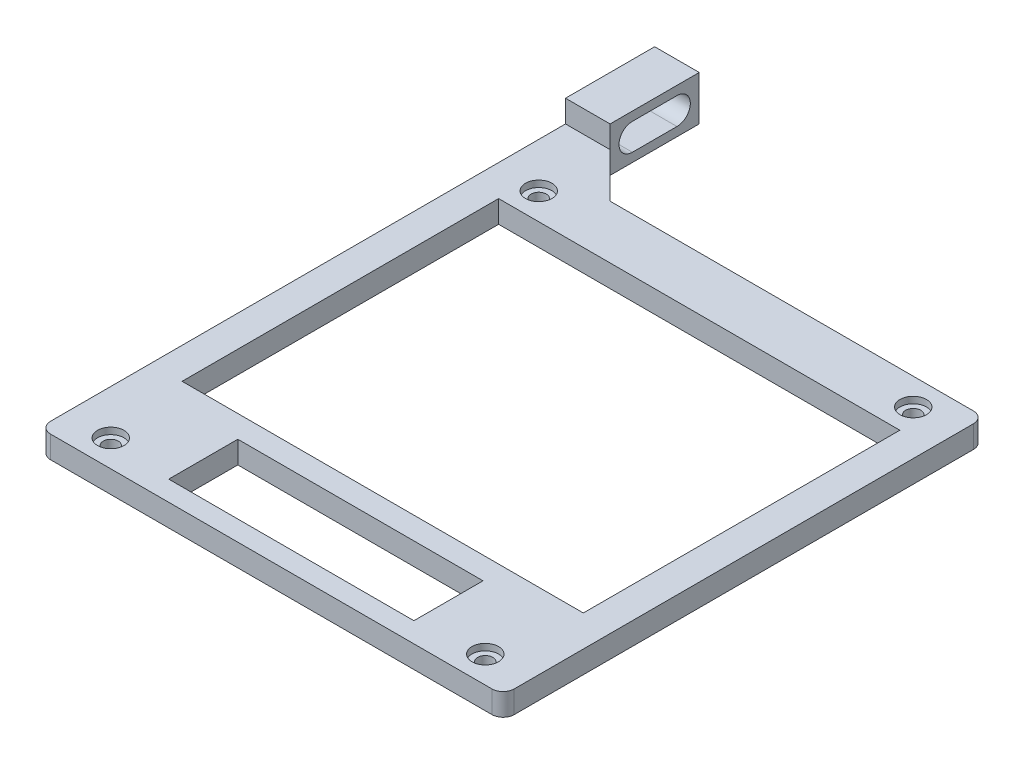
ISO-10303-21;
HEADER;
FILE_DESCRIPTION(('STEP AP214'),'2;1');
FILE_NAME('part.step','',(''),(''),'','','');
FILE_SCHEMA(('AUTOMOTIVE_DESIGN { 1 0 10303 214 1 1 1 1 }'));
ENDSEC;
DATA;
#1=APPLICATION_CONTEXT('core data for automotive mechanical design processes');
#2=APPLICATION_PROTOCOL_DEFINITION('international standard','automotive_design',2000,#1);
#3=PRODUCT_CONTEXT('',#1,'mechanical');
#4=PRODUCT('Part','Part','',(#3));
#5=PRODUCT_RELATED_PRODUCT_CATEGORY('part','',(#4));
#6=PRODUCT_DEFINITION_FORMATION('','',#4);
#7=PRODUCT_DEFINITION_CONTEXT('part definition',#1,'design');
#8=PRODUCT_DEFINITION('design','',#6,#7);
#9=PRODUCT_DEFINITION_SHAPE('','',#8);
#10=(LENGTH_UNIT() NAMED_UNIT(*) SI_UNIT(.MILLI.,.METRE.));
#11=(NAMED_UNIT(*) PLANE_ANGLE_UNIT() SI_UNIT($,.RADIAN.));
#12=(NAMED_UNIT(*) SI_UNIT($,.STERADIAN.) SOLID_ANGLE_UNIT());
#13=UNCERTAINTY_MEASURE_WITH_UNIT(LENGTH_MEASURE(1.E-05),#10,'distance_accuracy_value','');
#14=(GEOMETRIC_REPRESENTATION_CONTEXT(3) GLOBAL_UNCERTAINTY_ASSIGNED_CONTEXT((#13)) GLOBAL_UNIT_ASSIGNED_CONTEXT((#10,
#11,#12)) REPRESENTATION_CONTEXT('',''));
#15=CARTESIAN_POINT('',(0.,0.,0.));
#16=DIRECTION('',(0.,0.,1.));
#17=DIRECTION('',(1.,0.,0.));
#18=AXIS2_PLACEMENT_3D('',#15,#16,#17);
#19=CARTESIAN_POINT('',(0.,6.35,-137.16));
#20=DIRECTION('',(0.,0.,1.));
#21=DIRECTION('',(1.,0.,0.));
#22=AXIS2_PLACEMENT_3D('',#19,#20,#21);
#23=PLANE('',#22);
#24=DIRECTION('',(-1.,0.,0.));
#25=VECTOR('',#24,1.);
#26=CARTESIAN_POINT('',(0.,6.35,-137.16));
#27=LINE('',#26,#25);
#28=CARTESIAN_POINT('',(128.905,6.35,-137.16));
#29=VERTEX_POINT('',#28);
#30=CARTESIAN_POINT('',(25.4,6.35,-137.16));
#31=VERTEX_POINT('',#30);
#32=EDGE_CURVE('E364',#29,#31,#27,.T.);
#33=ORIENTED_EDGE('',*,*,#32,.F.);
#34=DIRECTION('',(0.,-1.,0.));
#35=VECTOR('',#34,1.);
#36=CARTESIAN_POINT('',(128.905,6.35,-137.16));
#37=LINE('',#36,#35);
#38=CARTESIAN_POINT('',(128.905,0.,-137.16));
#39=VERTEX_POINT('',#38);
#40=EDGE_CURVE('E395',#29,#39,#37,.T.);
#41=ORIENTED_EDGE('',*,*,#40,.T.);
#42=DIRECTION('',(-1.,0.,0.));
#43=VECTOR('',#42,1.);
#44=CARTESIAN_POINT('',(0.,0.,-137.16));
#45=LINE('',#44,#43);
#46=CARTESIAN_POINT('',(25.4,0.,-137.16));
#47=VERTEX_POINT('',#46);
#48=EDGE_CURVE('E356',#39,#47,#45,.T.);
#49=ORIENTED_EDGE('',*,*,#48,.T.);
#50=DIRECTION('',(0.,1.,0.));
#51=VECTOR('',#50,1.);
#52=CARTESIAN_POINT('',(25.4,6.35,-137.16));
#53=LINE('',#52,#51);
#54=EDGE_CURVE('E384',#47,#31,#53,.T.);
#55=ORIENTED_EDGE('',*,*,#54,.T.);
#56=EDGE_LOOP('',(#33,#41,#49,#55));
#57=FACE_BOUND('',#56,.T.);
#58=ADVANCED_FACE('F53',(#57),#23,.F.);
#59=CARTESIAN_POINT('',(0.,6.35,0.));
#60=DIRECTION('',(1.,0.,0.));
#61=DIRECTION('',(0.,0.,-1.));
#62=AXIS2_PLACEMENT_3D('',#59,#60,#61);
#63=PLANE('',#62);
#64=CARTESIAN_POINT('',(0.,6.35,-156.21));
#65=DIRECTION('',(-1.,0.,0.));
#66=DIRECTION('',(0.,0.,1.));
#67=AXIS2_PLACEMENT_3D('',#64,#65,#66);
#68=CIRCLE('',#67,3.81);
#69=CARTESIAN_POINT('',(0.,2.54,-156.21));
#70=VERTEX_POINT('',#69);
#71=CARTESIAN_POINT('',(0.,10.16,-156.21));
#72=VERTEX_POINT('',#71);
#73=EDGE_CURVE('E568',#70,#72,#68,.T.);
#74=ORIENTED_EDGE('',*,*,#73,.F.);
#75=DIRECTION('',(0.,0.,1.));
#76=VECTOR('',#75,1.);
#77=CARTESIAN_POINT('',(0.,2.54000000000003,0.));
#78=LINE('',#77,#76);
#79=CARTESIAN_POINT('',(0.,2.54,-168.91));
#80=VERTEX_POINT('',#79);
#81=EDGE_CURVE('E565',#80,#70,#78,.T.);
#82=ORIENTED_EDGE('',*,*,#81,.F.);
#83=CARTESIAN_POINT('',(0.,6.35,-168.91));
#84=DIRECTION('',(-1.,0.,0.));
#85=DIRECTION('',(0.,0.,1.));
#86=AXIS2_PLACEMENT_3D('',#83,#84,#85);
#87=CIRCLE('',#86,3.81);
#88=CARTESIAN_POINT('',(0.,10.16,-168.91));
#89=VERTEX_POINT('',#88);
#90=EDGE_CURVE('E576',#89,#80,#87,.T.);
#91=ORIENTED_EDGE('',*,*,#90,.F.);
#92=DIRECTION('',(0.,0.,1.));
#93=VECTOR('',#92,1.);
#94=CARTESIAN_POINT('',(0.,10.16,0.));
#95=LINE('',#94,#93);
#96=EDGE_CURVE('E572',#89,#72,#95,.T.);
#97=ORIENTED_EDGE('',*,*,#96,.T.);
#98=EDGE_LOOP('',(#74,#82,#91,#97));
#99=FACE_BOUND('',#98,.T.);
#100=DIRECTION('',(0.,0.,1.));
#101=VECTOR('',#100,1.);
#102=CARTESIAN_POINT('',(0.,0.,0.));
#103=LINE('',#102,#101);
#104=CARTESIAN_POINT('',(0.,0.,-175.26));
#105=VERTEX_POINT('',#104);
#106=CARTESIAN_POINT('',(0.,0.,-3.175));
#107=VERTEX_POINT('',#106);
#108=EDGE_CURVE('E350',#105,#107,#103,.T.);
#109=ORIENTED_EDGE('',*,*,#108,.T.);
#110=DIRECTION('',(0.,-1.,0.));
#111=VECTOR('',#110,1.);
#112=CARTESIAN_POINT('',(0.,6.35,-3.175));
#113=LINE('',#112,#111);
#114=CARTESIAN_POINT('',(0.,6.35,-3.175));
#115=VERTEX_POINT('',#114);
#116=EDGE_CURVE('E11',#107,#115,#113,.F.);
#117=ORIENTED_EDGE('',*,*,#116,.T.);
#118=DIRECTION('',(0.,0.,1.));
#119=VECTOR('',#118,1.);
#120=CARTESIAN_POINT('',(0.,6.35,0.));
#121=LINE('',#120,#119);
#122=CARTESIAN_POINT('',(0.,6.35,-149.86));
#123=VERTEX_POINT('',#122);
#124=EDGE_CURVE('E351',#123,#115,#121,.T.);
#125=ORIENTED_EDGE('',*,*,#124,.F.);
#126=DIRECTION('',(0.,1.,0.));
#127=VECTOR('',#126,1.);
#128=CARTESIAN_POINT('',(0.,6.35,-149.86));
#129=LINE('',#128,#127);
#130=CARTESIAN_POINT('',(0.,12.7,-149.86));
#131=VERTEX_POINT('',#130);
#132=EDGE_CURVE('E479',#123,#131,#129,.T.);
#133=ORIENTED_EDGE('',*,*,#132,.T.);
#134=DIRECTION('',(0.,0.,-1.));
#135=VECTOR('',#134,1.);
#136=CARTESIAN_POINT('',(0.,12.7,-149.86));
#137=LINE('',#136,#135);
#138=CARTESIAN_POINT('',(0.,12.7,-175.26));
#139=VERTEX_POINT('',#138);
#140=EDGE_CURVE('E481',#131,#139,#137,.T.);
#141=ORIENTED_EDGE('',*,*,#140,.T.);
#142=DIRECTION('',(0.,-1.,0.));
#143=VECTOR('',#142,1.);
#144=CARTESIAN_POINT('',(0.,6.35,-175.26));
#145=LINE('',#144,#143);
#146=EDGE_CURVE('E489',#139,#105,#145,.T.);
#147=ORIENTED_EDGE('',*,*,#146,.T.);
#148=EDGE_LOOP('',(#109,#117,#125,#133,#141,#147));
#149=FACE_BOUND('',#148,.T.);
#150=ADVANCED_FACE('F609',(#99,#149),#63,.F.);
#151=CARTESIAN_POINT('',(0.,6.35,0.));
#152=DIRECTION('',(0.,0.,-1.));
#153=DIRECTION('',(-1.,0.,0.));
#154=AXIS2_PLACEMENT_3D('',#151,#152,#153);
#155=PLANE('',#154);
#156=DIRECTION('',(1.,0.,0.));
#157=VECTOR('',#156,1.);
#158=CARTESIAN_POINT('',(0.,0.,0.));
#159=LINE('',#158,#157);
#160=CARTESIAN_POINT('',(3.175,0.,0.));
#161=VERTEX_POINT('',#160);
#162=CARTESIAN_POINT('',(128.905,0.,0.));
#163=VERTEX_POINT('',#162);
#164=EDGE_CURVE('E371',#161,#163,#159,.T.);
#165=ORIENTED_EDGE('',*,*,#164,.T.);
#166=DIRECTION('',(0.,-1.,0.));
#167=VECTOR('',#166,1.);
#168=CARTESIAN_POINT('',(128.905,6.35,0.));
#169=LINE('',#168,#167);
#170=CARTESIAN_POINT('',(128.905,6.35,0.));
#171=VERTEX_POINT('',#170);
#172=EDGE_CURVE('E62',#163,#171,#169,.F.);
#173=ORIENTED_EDGE('',*,*,#172,.T.);
#174=DIRECTION('',(1.,0.,0.));
#175=VECTOR('',#174,1.);
#176=CARTESIAN_POINT('',(0.,6.35,0.));
#177=LINE('',#176,#175);
#178=CARTESIAN_POINT('',(3.175,6.35,0.));
#179=VERTEX_POINT('',#178);
#180=EDGE_CURVE('E355',#179,#171,#177,.T.);
#181=ORIENTED_EDGE('',*,*,#180,.F.);
#182=DIRECTION('',(0.,-1.,0.));
#183=VECTOR('',#182,1.);
#184=CARTESIAN_POINT('',(3.175,6.35,0.));
#185=LINE('',#184,#183);
#186=EDGE_CURVE('E424',#179,#161,#185,.T.);
#187=ORIENTED_EDGE('',*,*,#186,.T.);
#188=EDGE_LOOP('',(#165,#173,#181,#187));
#189=FACE_BOUND('',#188,.T.);
#190=ADVANCED_FACE('F431',(#189),#155,.F.);
#191=CARTESIAN_POINT('',(132.08,6.35,0.));
#192=DIRECTION('',(-1.,0.,0.));
#193=DIRECTION('',(0.,0.,1.));
#194=AXIS2_PLACEMENT_3D('',#191,#192,#193);
#195=PLANE('',#194);
#196=DIRECTION('',(0.,0.,-1.));
#197=VECTOR('',#196,1.);
#198=CARTESIAN_POINT('',(132.08,0.,0.));
#199=LINE('',#198,#197);
#200=CARTESIAN_POINT('',(132.08,0.,-3.175));
#201=VERTEX_POINT('',#200);
#202=CARTESIAN_POINT('',(132.08,0.,-133.985));
#203=VERTEX_POINT('',#202);
#204=EDGE_CURVE('E375',#201,#203,#199,.T.);
#205=ORIENTED_EDGE('',*,*,#204,.T.);
#206=DIRECTION('',(0.,-1.,0.));
#207=VECTOR('',#206,1.);
#208=CARTESIAN_POINT('',(132.08,6.35,-133.985));
#209=LINE('',#208,#207);
#210=CARTESIAN_POINT('',(132.08,6.35,-133.985));
#211=VERTEX_POINT('',#210);
#212=EDGE_CURVE('E412',#203,#211,#209,.F.);
#213=ORIENTED_EDGE('',*,*,#212,.T.);
#214=DIRECTION('',(0.,0.,-1.));
#215=VECTOR('',#214,1.);
#216=CARTESIAN_POINT('',(132.08,6.35,0.));
#217=LINE('',#216,#215);
#218=CARTESIAN_POINT('',(132.08,6.35,-3.175));
#219=VERTEX_POINT('',#218);
#220=EDGE_CURVE('E360',#219,#211,#217,.T.);
#221=ORIENTED_EDGE('',*,*,#220,.F.);
#222=DIRECTION('',(0.,-1.,0.));
#223=VECTOR('',#222,1.);
#224=CARTESIAN_POINT('',(132.08,6.35,-3.175));
#225=LINE('',#224,#223);
#226=EDGE_CURVE('E408',#219,#201,#225,.T.);
#227=ORIENTED_EDGE('',*,*,#226,.T.);
#228=EDGE_LOOP('',(#205,#213,#221,#227));
#229=FACE_BOUND('',#228,.T.);
#230=ADVANCED_FACE('F443',(#229),#195,.F.);
#231=CARTESIAN_POINT('',(0.,6.35,0.));
#232=DIRECTION('',(0.,-1.,0.));
#233=DIRECTION('',(0.,0.,-1.));
#234=AXIS2_PLACEMENT_3D('',#231,#232,#233);
#235=PLANE('',#234);
#236=DIRECTION('',(0.,0.,-1.));
#237=VECTOR('',#236,1.);
#238=CARTESIAN_POINT('',(123.19,6.35,-15.24));
#239=LINE('',#238,#237);
#240=CARTESIAN_POINT('',(123.19,6.35,-31.75));
#241=VERTEX_POINT('',#240);
#242=CARTESIAN_POINT('',(123.19,6.35,-121.92));
#243=VERTEX_POINT('',#242);
#244=EDGE_CURVE('E258',#241,#243,#239,.T.);
#245=ORIENTED_EDGE('',*,*,#244,.F.);
#246=DIRECTION('',(-1.,0.,0.));
#247=VECTOR('',#246,1.);
#248=CARTESIAN_POINT('',(8.89000000000001,6.35,-31.75));
#249=LINE('',#248,#247);
#250=CARTESIAN_POINT('',(8.89000000000001,6.35,-31.75));
#251=VERTEX_POINT('',#250);
#252=EDGE_CURVE('E244',#241,#251,#249,.T.);
#253=ORIENTED_EDGE('',*,*,#252,.T.);
#254=DIRECTION('',(0.,0.,1.));
#255=VECTOR('',#254,1.);
#256=CARTESIAN_POINT('',(8.89000000000001,6.35,-15.24));
#257=LINE('',#256,#255);
#258=CARTESIAN_POINT('',(8.89000000000001,6.35,-121.92));
#259=VERTEX_POINT('',#258);
#260=EDGE_CURVE('E257',#259,#251,#257,.T.);
#261=ORIENTED_EDGE('',*,*,#260,.F.);
#262=DIRECTION('',(-1.,0.,0.));
#263=VECTOR('',#262,1.);
#264=CARTESIAN_POINT('',(8.89000000000001,6.35,-121.92));
#265=LINE('',#264,#263);
#266=EDGE_CURVE('E268',#243,#259,#265,.T.);
#267=ORIENTED_EDGE('',*,*,#266,.F.);
#268=EDGE_LOOP('',(#245,#253,#261,#267));
#269=FACE_BOUND('',#268,.T.);
#270=DIRECTION('',(0.,0.,1.));
#271=VECTOR('',#270,1.);
#272=CARTESIAN_POINT('',(31.115,6.35,-15.24));
#273=LINE('',#272,#271);
#274=CARTESIAN_POINT('',(31.115,6.35,-25.4));
#275=VERTEX_POINT('',#274);
#276=CARTESIAN_POINT('',(31.115,6.35,-5.71500000000002));
#277=VERTEX_POINT('',#276);
#278=EDGE_CURVE('E539',#275,#277,#273,.T.);
#279=ORIENTED_EDGE('',*,*,#278,.F.);
#280=DIRECTION('',(1.,0.,0.));
#281=VECTOR('',#280,1.);
#282=CARTESIAN_POINT('',(31.115,6.35,-25.4));
#283=LINE('',#282,#281);
#284=CARTESIAN_POINT('',(100.965,6.35,-25.4));
#285=VERTEX_POINT('',#284);
#286=EDGE_CURVE('E261',#275,#285,#283,.T.);
#287=ORIENTED_EDGE('',*,*,#286,.T.);
#288=DIRECTION('',(0.,0.,-1.));
#289=VECTOR('',#288,1.);
#290=CARTESIAN_POINT('',(100.965,6.35,-15.24));
#291=LINE('',#290,#289);
#292=CARTESIAN_POINT('',(100.965,6.35,-5.71500000000003));
#293=VERTEX_POINT('',#292);
#294=EDGE_CURVE('E536',#293,#285,#291,.T.);
#295=ORIENTED_EDGE('',*,*,#294,.F.);
#296=DIRECTION('',(1.,0.,0.));
#297=VECTOR('',#296,1.);
#298=CARTESIAN_POINT('',(31.115,6.35,-5.71500000000002));
#299=LINE('',#298,#297);
#300=EDGE_CURVE('E543',#277,#293,#299,.T.);
#301=ORIENTED_EDGE('',*,*,#300,.F.);
#302=EDGE_LOOP('',(#279,#287,#295,#301));
#303=FACE_BOUND('',#302,.T.);
#304=CARTESIAN_POINT('',(12.7,6.35,-129.54));
#305=DIRECTION('',(0.,1.,0.));
#306=DIRECTION('',(0.,0.,1.));
#307=AXIS2_PLACEMENT_3D('',#304,#305,#306);
#308=CIRCLE('',#307,3.77063);
#309=CARTESIAN_POINT('',(12.7,6.35,-125.76937));
#310=VERTEX_POINT('',#309);
#311=EDGE_CURVE('E281',#310,#310,#308,.T.);
#312=ORIENTED_EDGE('',*,*,#311,.F.);
#313=EDGE_LOOP('',(#312));
#314=FACE_BOUND('',#313,.T.);
#315=CARTESIAN_POINT('',(119.38,6.35,-129.54));
#316=DIRECTION('',(0.,1.,0.));
#317=DIRECTION('',(0.,0.,1.));
#318=AXIS2_PLACEMENT_3D('',#315,#316,#317);
#319=CIRCLE('',#318,3.77063);
#320=CARTESIAN_POINT('',(119.38,6.35,-125.76937));
#321=VERTEX_POINT('',#320);
#322=EDGE_CURVE('E302',#321,#321,#319,.T.);
#323=ORIENTED_EDGE('',*,*,#322,.F.);
#324=EDGE_LOOP('',(#323));
#325=FACE_BOUND('',#324,.T.);
#326=CARTESIAN_POINT('',(119.38,6.35,-7.62000000000002));
#327=DIRECTION('',(0.,1.,0.));
#328=DIRECTION('',(0.,0.,1.));
#329=AXIS2_PLACEMENT_3D('',#326,#327,#328);
#330=CIRCLE('',#329,3.77063);
#331=CARTESIAN_POINT('',(119.38,6.35,-3.84937000000003));
#332=VERTEX_POINT('',#331);
#333=EDGE_CURVE('E318',#332,#332,#330,.T.);
#334=ORIENTED_EDGE('',*,*,#333,.F.);
#335=EDGE_LOOP('',(#334));
#336=FACE_BOUND('',#335,.T.);
#337=CARTESIAN_POINT('',(12.7,6.35,-7.61999999999999));
#338=DIRECTION('',(0.,1.,0.));
#339=DIRECTION('',(0.,0.,1.));
#340=AXIS2_PLACEMENT_3D('',#337,#338,#339);
#341=CIRCLE('',#340,3.77063);
#342=CARTESIAN_POINT('',(12.7,6.35,-3.84936999999999));
#343=VERTEX_POINT('',#342);
#344=EDGE_CURVE('E334',#343,#343,#341,.T.);
#345=ORIENTED_EDGE('',*,*,#344,.F.);
#346=EDGE_LOOP('',(#345));
#347=FACE_BOUND('',#346,.T.);
#348=ORIENTED_EDGE('',*,*,#220,.T.);
#349=CARTESIAN_POINT('',(128.905,6.35,-133.985));
#350=DIRECTION('',(0.,-1.,0.));
#351=DIRECTION('',(0.,0.,-1.));
#352=AXIS2_PLACEMENT_3D('',#349,#350,#351);
#353=CIRCLE('',#352,3.175);
#354=EDGE_CURVE('E421',#211,#29,#353,.F.);
#355=ORIENTED_EDGE('',*,*,#354,.T.);
#356=ORIENTED_EDGE('',*,*,#32,.T.);
#357=DIRECTION('',(-0.707106781186544,0.,-0.707106781186551));
#358=VECTOR('',#357,1.);
#359=CARTESIAN_POINT('',(81.2800000000001,6.35,-81.2799999999992));
#360=LINE('',#359,#358);
#361=CARTESIAN_POINT('',(12.7,6.35,-149.86));
#362=VERTEX_POINT('',#361);
#363=EDGE_CURVE('E392',#31,#362,#360,.T.);
#364=ORIENTED_EDGE('',*,*,#363,.T.);
#365=DIRECTION('',(-1.,0.,0.));
#366=VECTOR('',#365,1.);
#367=CARTESIAN_POINT('',(0.,6.35,-149.86));
#368=LINE('',#367,#366);
#369=EDGE_CURVE('E459',#362,#123,#368,.T.);
#370=ORIENTED_EDGE('',*,*,#369,.T.);
#371=ORIENTED_EDGE('',*,*,#124,.T.);
#372=CARTESIAN_POINT('',(3.175,6.35,-3.175));
#373=DIRECTION('',(0.,-1.,0.));
#374=DIRECTION('',(0.,0.,-1.));
#375=AXIS2_PLACEMENT_3D('',#372,#373,#374);
#376=CIRCLE('',#375,3.175);
#377=EDGE_CURVE('E415',#115,#179,#376,.F.);
#378=ORIENTED_EDGE('',*,*,#377,.T.);
#379=ORIENTED_EDGE('',*,*,#180,.T.);
#380=CARTESIAN_POINT('',(128.905,6.35,-3.175));
#381=DIRECTION('',(0.,-1.,0.));
#382=DIRECTION('',(0.,0.,-1.));
#383=AXIS2_PLACEMENT_3D('',#380,#381,#382);
#384=CIRCLE('',#383,3.175);
#385=EDGE_CURVE('E418',#171,#219,#384,.F.);
#386=ORIENTED_EDGE('',*,*,#385,.T.);
#387=EDGE_LOOP('',(#348,#355,#356,#364,#370,#371,#378,#379,#386));
#388=FACE_BOUND('',#387,.T.);
#389=ADVANCED_FACE('F254',(#269,#303,#314,#325,#336,#347,#388),#235,.F.);
#390=CARTESIAN_POINT('',(0.,0.,0.));
#391=DIRECTION('',(0.,-1.,0.));
#392=DIRECTION('',(0.,0.,-1.));
#393=AXIS2_PLACEMENT_3D('',#390,#391,#392);
#394=PLANE('',#393);
#395=DIRECTION('',(-1.,0.,0.));
#396=VECTOR('',#395,1.);
#397=CARTESIAN_POINT('',(8.89000000000001,0.,-31.75));
#398=LINE('',#397,#396);
#399=CARTESIAN_POINT('',(123.19,0.,-31.75));
#400=VERTEX_POINT('',#399);
#401=CARTESIAN_POINT('',(8.89000000000001,0.,-31.75));
#402=VERTEX_POINT('',#401);
#403=EDGE_CURVE('E245',#400,#402,#398,.T.);
#404=ORIENTED_EDGE('',*,*,#403,.F.);
#405=DIRECTION('',(0.,0.,-1.));
#406=VECTOR('',#405,1.);
#407=CARTESIAN_POINT('',(123.19,0.,-15.24));
#408=LINE('',#407,#406);
#409=CARTESIAN_POINT('',(123.19,0.,-121.92));
#410=VERTEX_POINT('',#409);
#411=EDGE_CURVE('E69',#400,#410,#408,.T.);
#412=ORIENTED_EDGE('',*,*,#411,.T.);
#413=DIRECTION('',(-1.,0.,0.));
#414=VECTOR('',#413,1.);
#415=CARTESIAN_POINT('',(8.89000000000001,0.,-121.92));
#416=LINE('',#415,#414);
#417=CARTESIAN_POINT('',(8.89000000000001,0.,-121.92));
#418=VERTEX_POINT('',#417);
#419=EDGE_CURVE('E273',#410,#418,#416,.T.);
#420=ORIENTED_EDGE('',*,*,#419,.T.);
#421=DIRECTION('',(0.,0.,1.));
#422=VECTOR('',#421,1.);
#423=CARTESIAN_POINT('',(8.89000000000001,0.,-15.24));
#424=LINE('',#423,#422);
#425=EDGE_CURVE('E286',#418,#402,#424,.T.);
#426=ORIENTED_EDGE('',*,*,#425,.T.);
#427=EDGE_LOOP('',(#404,#412,#420,#426));
#428=FACE_BOUND('',#427,.T.);
#429=DIRECTION('',(1.,0.,0.));
#430=VECTOR('',#429,1.);
#431=CARTESIAN_POINT('',(31.115,0.,-25.4));
#432=LINE('',#431,#430);
#433=CARTESIAN_POINT('',(31.115,0.,-25.4));
#434=VERTEX_POINT('',#433);
#435=CARTESIAN_POINT('',(100.965,0.,-25.4));
#436=VERTEX_POINT('',#435);
#437=EDGE_CURVE('E520',#434,#436,#432,.T.);
#438=ORIENTED_EDGE('',*,*,#437,.F.);
#439=DIRECTION('',(0.,0.,1.));
#440=VECTOR('',#439,1.);
#441=CARTESIAN_POINT('',(31.115,0.,-15.24));
#442=LINE('',#441,#440);
#443=CARTESIAN_POINT('',(31.115,0.,-5.71500000000002));
#444=VERTEX_POINT('',#443);
#445=EDGE_CURVE('E250',#434,#444,#442,.T.);
#446=ORIENTED_EDGE('',*,*,#445,.T.);
#447=DIRECTION('',(1.,0.,0.));
#448=VECTOR('',#447,1.);
#449=CARTESIAN_POINT('',(31.115,0.,-5.71500000000002));
#450=LINE('',#449,#448);
#451=CARTESIAN_POINT('',(100.965,0.,-5.71500000000003));
#452=VERTEX_POINT('',#451);
#453=EDGE_CURVE('E529',#444,#452,#450,.T.);
#454=ORIENTED_EDGE('',*,*,#453,.T.);
#455=DIRECTION('',(0.,0.,-1.));
#456=VECTOR('',#455,1.);
#457=CARTESIAN_POINT('',(100.965,0.,-15.24));
#458=LINE('',#457,#456);
#459=EDGE_CURVE('E533',#452,#436,#458,.T.);
#460=ORIENTED_EDGE('',*,*,#459,.T.);
#461=EDGE_LOOP('',(#438,#446,#454,#460));
#462=FACE_BOUND('',#461,.T.);
#463=CARTESIAN_POINT('',(12.7,0.,-129.54));
#464=DIRECTION('',(0.,-1.,0.));
#465=DIRECTION('',(0.,0.,-1.));
#466=AXIS2_PLACEMENT_3D('',#463,#464,#465);
#467=CIRCLE('',#466,2.15265000000002);
#468=CARTESIAN_POINT('',(12.7,0.,-131.69265));
#469=VERTEX_POINT('',#468);
#470=EDGE_CURVE('E298',#469,#469,#467,.T.);
#471=ORIENTED_EDGE('',*,*,#470,.F.);
#472=EDGE_LOOP('',(#471));
#473=FACE_BOUND('',#472,.T.);
#474=CARTESIAN_POINT('',(119.38,0.,-129.54));
#475=DIRECTION('',(0.,-1.,0.));
#476=DIRECTION('',(0.,0.,-1.));
#477=AXIS2_PLACEMENT_3D('',#474,#475,#476);
#478=CIRCLE('',#477,2.15265000000001);
#479=CARTESIAN_POINT('',(119.38,0.,-131.69265));
#480=VERTEX_POINT('',#479);
#481=EDGE_CURVE('E314',#480,#480,#478,.T.);
#482=ORIENTED_EDGE('',*,*,#481,.F.);
#483=EDGE_LOOP('',(#482));
#484=FACE_BOUND('',#483,.T.);
#485=CARTESIAN_POINT('',(119.38,0.,-7.62000000000002));
#486=DIRECTION('',(0.,-1.,0.));
#487=DIRECTION('',(0.,0.,-1.));
#488=AXIS2_PLACEMENT_3D('',#485,#486,#487);
#489=CIRCLE('',#488,2.15265000000001);
#490=CARTESIAN_POINT('',(119.38,0.,-9.77265000000004));
#491=VERTEX_POINT('',#490);
#492=EDGE_CURVE('E330',#491,#491,#489,.T.);
#493=ORIENTED_EDGE('',*,*,#492,.F.);
#494=EDGE_LOOP('',(#493));
#495=FACE_BOUND('',#494,.T.);
#496=CARTESIAN_POINT('',(12.7,0.,-7.61999999999999));
#497=DIRECTION('',(0.,-1.,0.));
#498=DIRECTION('',(0.,0.,-1.));
#499=AXIS2_PLACEMENT_3D('',#496,#497,#498);
#500=CIRCLE('',#499,2.15265000000002);
#501=CARTESIAN_POINT('',(12.7,0.,-9.77265000000001));
#502=VERTEX_POINT('',#501);
#503=EDGE_CURVE('E346',#502,#502,#500,.T.);
#504=ORIENTED_EDGE('',*,*,#503,.F.);
#505=EDGE_LOOP('',(#504));
#506=FACE_BOUND('',#505,.T.);
#507=ORIENTED_EDGE('',*,*,#48,.F.);
#508=CARTESIAN_POINT('',(128.905,0.,-133.985));
#509=DIRECTION('',(0.,-1.,0.));
#510=DIRECTION('',(0.,0.,-1.));
#511=AXIS2_PLACEMENT_3D('',#508,#509,#510);
#512=CIRCLE('',#511,3.175);
#513=EDGE_CURVE('E405',#39,#203,#512,.T.);
#514=ORIENTED_EDGE('',*,*,#513,.T.);
#515=ORIENTED_EDGE('',*,*,#204,.F.);
#516=CARTESIAN_POINT('',(128.905,0.,-3.175));
#517=DIRECTION('',(0.,-1.,0.));
#518=DIRECTION('',(0.,0.,-1.));
#519=AXIS2_PLACEMENT_3D('',#516,#517,#518);
#520=CIRCLE('',#519,3.175);
#521=EDGE_CURVE('E402',#201,#163,#520,.T.);
#522=ORIENTED_EDGE('',*,*,#521,.T.);
#523=ORIENTED_EDGE('',*,*,#164,.F.);
#524=CARTESIAN_POINT('',(3.175,0.,-3.175));
#525=DIRECTION('',(0.,-1.,0.));
#526=DIRECTION('',(0.,0.,-1.));
#527=AXIS2_PLACEMENT_3D('',#524,#525,#526);
#528=CIRCLE('',#527,3.175);
#529=EDGE_CURVE('E399',#161,#107,#528,.T.);
#530=ORIENTED_EDGE('',*,*,#529,.T.);
#531=ORIENTED_EDGE('',*,*,#108,.F.);
#532=DIRECTION('',(1.,0.,0.));
#533=VECTOR('',#532,1.);
#534=CARTESIAN_POINT('',(0.,0.,-175.26));
#535=LINE('',#534,#533);
#536=CARTESIAN_POINT('',(12.7,0.,-175.26));
#537=VERTEX_POINT('',#536);
#538=EDGE_CURVE('E487',#105,#537,#535,.T.);
#539=ORIENTED_EDGE('',*,*,#538,.T.);
#540=DIRECTION('',(0.,0.,1.));
#541=VECTOR('',#540,1.);
#542=CARTESIAN_POINT('',(12.7,0.,-137.16));
#543=LINE('',#542,#541);
#544=CARTESIAN_POINT('',(12.7,0.,-149.86));
#545=VERTEX_POINT('',#544);
#546=EDGE_CURVE('E485',#537,#545,#543,.T.);
#547=ORIENTED_EDGE('',*,*,#546,.T.);
#548=DIRECTION('',(0.707106781186544,0.,0.707106781186551));
#549=VECTOR('',#548,1.);
#550=CARTESIAN_POINT('',(12.7,0.,-149.86));
#551=LINE('',#550,#549);
#552=EDGE_CURVE('E388',#545,#47,#551,.T.);
#553=ORIENTED_EDGE('',*,*,#552,.T.);
#554=EDGE_LOOP('',(#507,#514,#515,#522,#523,#530,#531,#539,#547,#553));
#555=FACE_BOUND('',#554,.T.);
#556=ADVANCED_FACE('F447',(#428,#462,#473,#484,#495,#506,#555),#394,.T.);
#557=CARTESIAN_POINT('',(12.7,6.35,-7.61999999999999));
#558=DIRECTION('',(0.,1.,0.));
#559=DIRECTION('',(0.,0.,1.));
#560=AXIS2_PLACEMENT_3D('',#557,#558,#559);
#561=CYLINDRICAL_SURFACE('',#560,2.15265000000002);
#562=CARTESIAN_POINT('',(12.7,4.4958,-7.61999999999999));
#563=DIRECTION('',(0.,1.,0.));
#564=DIRECTION('',(0.,0.,1.));
#565=AXIS2_PLACEMENT_3D('',#562,#563,#564);
#566=CIRCLE('',#565,2.15265000000004);
#567=CARTESIAN_POINT('',(12.7,4.4958,-5.46734999999995));
#568=VERTEX_POINT('',#567);
#569=EDGE_CURVE('E342',#568,#568,#566,.T.);
#570=ORIENTED_EDGE('',*,*,#569,.T.);
#571=EDGE_LOOP('',(#570));
#572=FACE_BOUND('',#571,.T.);
#573=ORIENTED_EDGE('',*,*,#503,.T.);
#574=EDGE_LOOP('',(#573));
#575=FACE_BOUND('',#574,.T.);
#576=ADVANCED_FACE('F816',(#572,#575),#561,.F.);
#577=CARTESIAN_POINT('',(14.85265,4.4958,-7.61999999999999));
#578=DIRECTION('',(0.,-1.,0.));
#579=DIRECTION('',(0.,0.,-1.));
#580=AXIS2_PLACEMENT_3D('',#577,#578,#579);
#581=PLANE('',#580);
#582=ORIENTED_EDGE('',*,*,#569,.F.);
#583=EDGE_LOOP('',(#582));
#584=FACE_BOUND('',#583,.T.);
#585=CARTESIAN_POINT('',(12.7,4.4958,-7.61999999999999));
#586=DIRECTION('',(0.,1.,0.));
#587=DIRECTION('',(0.,0.,1.));
#588=AXIS2_PLACEMENT_3D('',#585,#586,#587);
#589=CIRCLE('',#588,3.77063);
#590=CARTESIAN_POINT('',(12.7,4.4958,-3.84936999999999));
#591=VERTEX_POINT('',#590);
#592=EDGE_CURVE('E338',#591,#591,#589,.T.);
#593=ORIENTED_EDGE('',*,*,#592,.T.);
#594=EDGE_LOOP('',(#593));
#595=FACE_BOUND('',#594,.T.);
#596=ADVANCED_FACE('F807',(#584,#595),#581,.F.);
#597=CARTESIAN_POINT('',(12.7,6.35,-7.61999999999999));
#598=DIRECTION('',(0.,1.,0.));
#599=DIRECTION('',(0.,0.,1.));
#600=AXIS2_PLACEMENT_3D('',#597,#598,#599);
#601=CYLINDRICAL_SURFACE('',#600,3.77063);
#602=ORIENTED_EDGE('',*,*,#592,.F.);
#603=EDGE_LOOP('',(#602));
#604=FACE_BOUND('',#603,.T.);
#605=ORIENTED_EDGE('',*,*,#344,.T.);
#606=EDGE_LOOP('',(#605));
#607=FACE_BOUND('',#606,.T.);
#608=ADVANCED_FACE('F798',(#604,#607),#601,.F.);
#609=CARTESIAN_POINT('',(119.38,6.35,-7.62000000000002));
#610=DIRECTION('',(0.,1.,0.));
#611=DIRECTION('',(0.,0.,1.));
#612=AXIS2_PLACEMENT_3D('',#609,#610,#611);
#613=CYLINDRICAL_SURFACE('',#612,2.15265000000001);
#614=CARTESIAN_POINT('',(119.38,4.4958,-7.62000000000002));
#615=DIRECTION('',(0.,1.,0.));
#616=DIRECTION('',(0.,0.,1.));
#617=AXIS2_PLACEMENT_3D('',#614,#615,#616);
#618=CIRCLE('',#617,2.15265000000003);
#619=CARTESIAN_POINT('',(119.38,4.4958,-5.46734999999999));
#620=VERTEX_POINT('',#619);
#621=EDGE_CURVE('E326',#620,#620,#618,.T.);
#622=ORIENTED_EDGE('',*,*,#621,.T.);
#623=EDGE_LOOP('',(#622));
#624=FACE_BOUND('',#623,.T.);
#625=ORIENTED_EDGE('',*,*,#492,.T.);
#626=EDGE_LOOP('',(#625));
#627=FACE_BOUND('',#626,.T.);
#628=ADVANCED_FACE('F789',(#624,#627),#613,.F.);
#629=CARTESIAN_POINT('',(121.53265,4.4958,-7.62000000000002));
#630=DIRECTION('',(0.,-1.,0.));
#631=DIRECTION('',(0.,0.,-1.));
#632=AXIS2_PLACEMENT_3D('',#629,#630,#631);
#633=PLANE('',#632);
#634=ORIENTED_EDGE('',*,*,#621,.F.);
#635=EDGE_LOOP('',(#634));
#636=FACE_BOUND('',#635,.T.);
#637=CARTESIAN_POINT('',(119.38,4.4958,-7.62000000000002));
#638=DIRECTION('',(0.,1.,0.));
#639=DIRECTION('',(0.,0.,1.));
#640=AXIS2_PLACEMENT_3D('',#637,#638,#639);
#641=CIRCLE('',#640,3.77063);
#642=CARTESIAN_POINT('',(119.38,4.4958,-3.84937000000003));
#643=VERTEX_POINT('',#642);
#644=EDGE_CURVE('E322',#643,#643,#641,.T.);
#645=ORIENTED_EDGE('',*,*,#644,.T.);
#646=EDGE_LOOP('',(#645));
#647=FACE_BOUND('',#646,.T.);
#648=ADVANCED_FACE('F780',(#636,#647),#633,.F.);
#649=CARTESIAN_POINT('',(119.38,6.35,-7.62000000000002));
#650=DIRECTION('',(0.,1.,0.));
#651=DIRECTION('',(0.,0.,1.));
#652=AXIS2_PLACEMENT_3D('',#649,#650,#651);
#653=CYLINDRICAL_SURFACE('',#652,3.77063);
#654=ORIENTED_EDGE('',*,*,#644,.F.);
#655=EDGE_LOOP('',(#654));
#656=FACE_BOUND('',#655,.T.);
#657=ORIENTED_EDGE('',*,*,#333,.T.);
#658=EDGE_LOOP('',(#657));
#659=FACE_BOUND('',#658,.T.);
#660=ADVANCED_FACE('F771',(#656,#659),#653,.F.);
#661=CARTESIAN_POINT('',(119.38,6.35,-129.54));
#662=DIRECTION('',(0.,1.,0.));
#663=DIRECTION('',(0.,0.,1.));
#664=AXIS2_PLACEMENT_3D('',#661,#662,#663);
#665=CYLINDRICAL_SURFACE('',#664,2.15265000000001);
#666=CARTESIAN_POINT('',(119.38,4.4958,-129.54));
#667=DIRECTION('',(0.,1.,0.));
#668=DIRECTION('',(0.,0.,1.));
#669=AXIS2_PLACEMENT_3D('',#666,#667,#668);
#670=CIRCLE('',#669,2.15265000000003);
#671=CARTESIAN_POINT('',(119.38,4.4958,-127.38735));
#672=VERTEX_POINT('',#671);
#673=EDGE_CURVE('E310',#672,#672,#670,.T.);
#674=ORIENTED_EDGE('',*,*,#673,.T.);
#675=EDGE_LOOP('',(#674));
#676=FACE_BOUND('',#675,.T.);
#677=ORIENTED_EDGE('',*,*,#481,.T.);
#678=EDGE_LOOP('',(#677));
#679=FACE_BOUND('',#678,.T.);
#680=ADVANCED_FACE('F762',(#676,#679),#665,.F.);
#681=CARTESIAN_POINT('',(121.53265,4.4958,-129.54));
#682=DIRECTION('',(0.,-1.,0.));
#683=DIRECTION('',(0.,0.,-1.));
#684=AXIS2_PLACEMENT_3D('',#681,#682,#683);
#685=PLANE('',#684);
#686=ORIENTED_EDGE('',*,*,#673,.F.);
#687=EDGE_LOOP('',(#686));
#688=FACE_BOUND('',#687,.T.);
#689=CARTESIAN_POINT('',(119.38,4.4958,-129.54));
#690=DIRECTION('',(0.,1.,0.));
#691=DIRECTION('',(0.,0.,1.));
#692=AXIS2_PLACEMENT_3D('',#689,#690,#691);
#693=CIRCLE('',#692,3.77063);
#694=CARTESIAN_POINT('',(119.38,4.4958,-125.76937));
#695=VERTEX_POINT('',#694);
#696=EDGE_CURVE('E306',#695,#695,#693,.T.);
#697=ORIENTED_EDGE('',*,*,#696,.T.);
#698=EDGE_LOOP('',(#697));
#699=FACE_BOUND('',#698,.T.);
#700=ADVANCED_FACE('F753',(#688,#699),#685,.F.);
#701=CARTESIAN_POINT('',(119.38,6.35,-129.54));
#702=DIRECTION('',(0.,1.,0.));
#703=DIRECTION('',(0.,0.,1.));
#704=AXIS2_PLACEMENT_3D('',#701,#702,#703);
#705=CYLINDRICAL_SURFACE('',#704,3.77063);
#706=ORIENTED_EDGE('',*,*,#696,.F.);
#707=EDGE_LOOP('',(#706));
#708=FACE_BOUND('',#707,.T.);
#709=ORIENTED_EDGE('',*,*,#322,.T.);
#710=EDGE_LOOP('',(#709));
#711=FACE_BOUND('',#710,.T.);
#712=ADVANCED_FACE('F744',(#708,#711),#705,.F.);
#713=CARTESIAN_POINT('',(12.7,6.35,-129.54));
#714=DIRECTION('',(0.,1.,0.));
#715=DIRECTION('',(0.,0.,1.));
#716=AXIS2_PLACEMENT_3D('',#713,#714,#715);
#717=CYLINDRICAL_SURFACE('',#716,2.15265000000002);
#718=CARTESIAN_POINT('',(12.7,4.4958,-129.54));
#719=DIRECTION('',(0.,1.,0.));
#720=DIRECTION('',(0.,0.,1.));
#721=AXIS2_PLACEMENT_3D('',#718,#719,#720);
#722=CIRCLE('',#721,2.15265000000004);
#723=CARTESIAN_POINT('',(12.7,4.4958,-127.38735));
#724=VERTEX_POINT('',#723);
#725=EDGE_CURVE('E294',#724,#724,#722,.T.);
#726=ORIENTED_EDGE('',*,*,#725,.T.);
#727=EDGE_LOOP('',(#726));
#728=FACE_BOUND('',#727,.T.);
#729=ORIENTED_EDGE('',*,*,#470,.T.);
#730=EDGE_LOOP('',(#729));
#731=FACE_BOUND('',#730,.T.);
#732=ADVANCED_FACE('F735',(#728,#731),#717,.F.);
#733=CARTESIAN_POINT('',(14.85265,4.4958,-129.54));
#734=DIRECTION('',(0.,-1.,0.));
#735=DIRECTION('',(0.,0.,-1.));
#736=AXIS2_PLACEMENT_3D('',#733,#734,#735);
#737=PLANE('',#736);
#738=ORIENTED_EDGE('',*,*,#725,.F.);
#739=EDGE_LOOP('',(#738));
#740=FACE_BOUND('',#739,.T.);
#741=CARTESIAN_POINT('',(12.7,4.4958,-129.54));
#742=DIRECTION('',(0.,1.,0.));
#743=DIRECTION('',(0.,0.,1.));
#744=AXIS2_PLACEMENT_3D('',#741,#742,#743);
#745=CIRCLE('',#744,3.77063);
#746=CARTESIAN_POINT('',(12.7,4.4958,-125.76937));
#747=VERTEX_POINT('',#746);
#748=EDGE_CURVE('E290',#747,#747,#745,.T.);
#749=ORIENTED_EDGE('',*,*,#748,.T.);
#750=EDGE_LOOP('',(#749));
#751=FACE_BOUND('',#750,.T.);
#752=ADVANCED_FACE('F725',(#740,#751),#737,.F.);
#753=CARTESIAN_POINT('',(12.7,6.35,-129.54));
#754=DIRECTION('',(0.,1.,0.));
#755=DIRECTION('',(0.,0.,1.));
#756=AXIS2_PLACEMENT_3D('',#753,#754,#755);
#757=CYLINDRICAL_SURFACE('',#756,3.77063);
#758=ORIENTED_EDGE('',*,*,#748,.F.);
#759=EDGE_LOOP('',(#758));
#760=FACE_BOUND('',#759,.T.);
#761=ORIENTED_EDGE('',*,*,#311,.T.);
#762=EDGE_LOOP('',(#761));
#763=FACE_BOUND('',#762,.T.);
#764=ADVANCED_FACE('F721',(#760,#763),#757,.F.);
#765=CARTESIAN_POINT('',(123.19,0.,-15.24));
#766=DIRECTION('',(1.,0.,0.));
#767=DIRECTION('',(0.,0.,-1.));
#768=AXIS2_PLACEMENT_3D('',#765,#766,#767);
#769=PLANE('',#768);
#770=ORIENTED_EDGE('',*,*,#411,.F.);
#771=DIRECTION('',(0.,1.,0.));
#772=VECTOR('',#771,1.);
#773=CARTESIAN_POINT('',(123.19,-115.486233378702,-31.75));
#774=LINE('',#773,#772);
#775=EDGE_CURVE('E74',#400,#241,#774,.T.);
#776=ORIENTED_EDGE('',*,*,#775,.T.);
#777=ORIENTED_EDGE('',*,*,#244,.T.);
#778=DIRECTION('',(0.,1.,0.));
#779=VECTOR('',#778,1.);
#780=CARTESIAN_POINT('',(123.19,0.,-121.92));
#781=LINE('',#780,#779);
#782=EDGE_CURVE('E282',#410,#243,#781,.T.);
#783=ORIENTED_EDGE('',*,*,#782,.F.);
#784=EDGE_LOOP('',(#770,#776,#777,#783));
#785=FACE_BOUND('',#784,.T.);
#786=ADVANCED_FACE('F507',(#785),#769,.F.);
#787=CARTESIAN_POINT('',(8.89000000000001,0.,-15.24));
#788=DIRECTION('',(-1.,0.,0.));
#789=DIRECTION('',(0.,0.,1.));
#790=AXIS2_PLACEMENT_3D('',#787,#788,#789);
#791=PLANE('',#790);
#792=ORIENTED_EDGE('',*,*,#260,.T.);
#793=DIRECTION('',(0.,1.,0.));
#794=VECTOR('',#793,1.);
#795=CARTESIAN_POINT('',(8.89000000000001,-115.486233378702,-31.75));
#796=LINE('',#795,#794);
#797=EDGE_CURVE('E241',#402,#251,#796,.T.);
#798=ORIENTED_EDGE('',*,*,#797,.F.);
#799=ORIENTED_EDGE('',*,*,#425,.F.);
#800=DIRECTION('',(0.,1.,0.));
#801=VECTOR('',#800,1.);
#802=CARTESIAN_POINT('',(8.89000000000001,0.,-121.92));
#803=LINE('',#802,#801);
#804=EDGE_CURVE('E265',#418,#259,#803,.T.);
#805=ORIENTED_EDGE('',*,*,#804,.T.);
#806=EDGE_LOOP('',(#792,#798,#799,#805));
#807=FACE_BOUND('',#806,.T.);
#808=ADVANCED_FACE('F263',(#807),#791,.F.);
#809=CARTESIAN_POINT('',(8.89000000000001,0.,-121.92));
#810=DIRECTION('',(0.,0.,-1.));
#811=DIRECTION('',(-1.,0.,0.));
#812=AXIS2_PLACEMENT_3D('',#809,#810,#811);
#813=PLANE('',#812);
#814=ORIENTED_EDGE('',*,*,#266,.T.);
#815=ORIENTED_EDGE('',*,*,#804,.F.);
#816=ORIENTED_EDGE('',*,*,#419,.F.);
#817=ORIENTED_EDGE('',*,*,#782,.T.);
#818=EDGE_LOOP('',(#814,#815,#816,#817));
#819=FACE_BOUND('',#818,.T.);
#820=ADVANCED_FACE('F510',(#819),#813,.F.);
#821=CARTESIAN_POINT('',(12.7,6.35,-137.16));
#822=DIRECTION('',(1.,0.,0.));
#823=DIRECTION('',(0.,0.,-1.));
#824=AXIS2_PLACEMENT_3D('',#821,#822,#823);
#825=PLANE('',#824);
#826=DIRECTION('',(0.,0.,1.));
#827=VECTOR('',#826,1.);
#828=CARTESIAN_POINT('',(12.7,2.54000000000003,0.));
#829=LINE('',#828,#827);
#830=CARTESIAN_POINT('',(12.7,2.54,-168.91));
#831=VERTEX_POINT('',#830);
#832=CARTESIAN_POINT('',(12.7,2.54,-156.21));
#833=VERTEX_POINT('',#832);
#834=EDGE_CURVE('E561',#831,#833,#829,.T.);
#835=ORIENTED_EDGE('',*,*,#834,.T.);
#836=CARTESIAN_POINT('',(12.7,6.35,-156.21));
#837=DIRECTION('',(1.,0.,0.));
#838=DIRECTION('',(0.,0.,-1.));
#839=AXIS2_PLACEMENT_3D('',#836,#837,#838);
#840=CIRCLE('',#839,3.81);
#841=CARTESIAN_POINT('',(12.7,10.16,-156.21));
#842=VERTEX_POINT('',#841);
#843=EDGE_CURVE('E584',#833,#842,#840,.F.);
#844=ORIENTED_EDGE('',*,*,#843,.T.);
#845=DIRECTION('',(0.,0.,1.));
#846=VECTOR('',#845,1.);
#847=CARTESIAN_POINT('',(12.7,10.16,0.));
#848=LINE('',#847,#846);
#849=CARTESIAN_POINT('',(12.7,10.16,-168.91));
#850=VERTEX_POINT('',#849);
#851=EDGE_CURVE('E551',#850,#842,#848,.T.);
#852=ORIENTED_EDGE('',*,*,#851,.F.);
#853=CARTESIAN_POINT('',(12.7,6.35,-168.91));
#854=DIRECTION('',(1.,0.,0.));
#855=DIRECTION('',(0.,0.,-1.));
#856=AXIS2_PLACEMENT_3D('',#853,#854,#855);
#857=CIRCLE('',#856,3.81);
#858=EDGE_CURVE('E557',#850,#831,#857,.F.);
#859=ORIENTED_EDGE('',*,*,#858,.T.);
#860=EDGE_LOOP('',(#835,#844,#852,#859));
#861=FACE_BOUND('',#860,.T.);
#862=DIRECTION('',(0.,-1.,0.));
#863=VECTOR('',#862,1.);
#864=CARTESIAN_POINT('',(12.7,6.35,-149.86));
#865=LINE('',#864,#863);
#866=CARTESIAN_POINT('',(12.7,12.7,-149.86));
#867=VERTEX_POINT('',#866);
#868=EDGE_CURVE('E465',#867,#362,#865,.T.);
#869=ORIENTED_EDGE('',*,*,#868,.T.);
#870=DIRECTION('',(0.,-1.,0.));
#871=VECTOR('',#870,1.);
#872=CARTESIAN_POINT('',(12.7,6.35,-149.86));
#873=LINE('',#872,#871);
#874=EDGE_CURVE('E367',#362,#545,#873,.T.);
#875=ORIENTED_EDGE('',*,*,#874,.T.);
#876=ORIENTED_EDGE('',*,*,#546,.F.);
#877=DIRECTION('',(0.,-1.,0.));
#878=VECTOR('',#877,1.);
#879=CARTESIAN_POINT('',(12.7,6.35,-175.26));
#880=LINE('',#879,#878);
#881=CARTESIAN_POINT('',(12.7,12.7,-175.26));
#882=VERTEX_POINT('',#881);
#883=EDGE_CURVE('E493',#882,#537,#880,.T.);
#884=ORIENTED_EDGE('',*,*,#883,.F.);
#885=DIRECTION('',(0.,0.,-1.));
#886=VECTOR('',#885,1.);
#887=CARTESIAN_POINT('',(12.7,12.7,-149.86));
#888=LINE('',#887,#886);
#889=EDGE_CURVE('E470',#867,#882,#888,.T.);
#890=ORIENTED_EDGE('',*,*,#889,.F.);
#891=EDGE_LOOP('',(#869,#875,#876,#884,#890));
#892=FACE_BOUND('',#891,.T.);
#893=ADVANCED_FACE('F466',(#861,#892),#825,.T.);
#894=CARTESIAN_POINT('',(0.,6.35,-175.26));
#895=DIRECTION('',(0.,0.,-1.));
#896=DIRECTION('',(-1.,0.,0.));
#897=AXIS2_PLACEMENT_3D('',#894,#895,#896);
#898=PLANE('',#897);
#899=ORIENTED_EDGE('',*,*,#538,.F.);
#900=ORIENTED_EDGE('',*,*,#146,.F.);
#901=DIRECTION('',(1.,0.,0.));
#902=VECTOR('',#901,1.);
#903=CARTESIAN_POINT('',(0.,12.7,-175.26));
#904=LINE('',#903,#902);
#905=EDGE_CURVE('E597',#139,#882,#904,.T.);
#906=ORIENTED_EDGE('',*,*,#905,.T.);
#907=ORIENTED_EDGE('',*,*,#883,.T.);
#908=EDGE_LOOP('',(#899,#900,#906,#907));
#909=FACE_BOUND('',#908,.T.);
#910=ADVANCED_FACE('F613',(#909),#898,.T.);
#911=CARTESIAN_POINT('',(0.,12.7,-149.86));
#912=DIRECTION('',(0.,1.,0.));
#913=DIRECTION('',(-1.,0.,0.));
#914=AXIS2_PLACEMENT_3D('',#911,#912,#913);
#915=PLANE('',#914);
#916=ORIENTED_EDGE('',*,*,#905,.F.);
#917=ORIENTED_EDGE('',*,*,#140,.F.);
#918=DIRECTION('',(1.,0.,0.));
#919=VECTOR('',#918,1.);
#920=CARTESIAN_POINT('',(0.,12.7,-149.86));
#921=LINE('',#920,#919);
#922=EDGE_CURVE('E475',#131,#867,#921,.T.);
#923=ORIENTED_EDGE('',*,*,#922,.T.);
#924=ORIENTED_EDGE('',*,*,#889,.T.);
#925=EDGE_LOOP('',(#916,#917,#923,#924));
#926=FACE_BOUND('',#925,.T.);
#927=ADVANCED_FACE('F611',(#926),#915,.T.);
#928=CARTESIAN_POINT('',(0.,0.,-149.86));
#929=DIRECTION('',(0.,0.,-1.));
#930=DIRECTION('',(-1.,0.,0.));
#931=AXIS2_PLACEMENT_3D('',#928,#929,#930);
#932=PLANE('',#931);
#933=ORIENTED_EDGE('',*,*,#132,.F.);
#934=ORIENTED_EDGE('',*,*,#369,.F.);
#935=ORIENTED_EDGE('',*,*,#868,.F.);
#936=ORIENTED_EDGE('',*,*,#922,.F.);
#937=EDGE_LOOP('',(#933,#934,#935,#936));
#938=FACE_BOUND('',#937,.T.);
#939=ADVANCED_FACE('F477',(#938),#932,.F.);
#940=CARTESIAN_POINT('',(132.081,2.54000000000003,0.));
#941=DIRECTION('',(0.,-1.,0.));
#942=DIRECTION('',(0.,0.,-1.));
#943=AXIS2_PLACEMENT_3D('',#940,#941,#942);
#944=PLANE('',#943);
#945=DIRECTION('',(-1.,0.,0.));
#946=VECTOR('',#945,1.);
#947=CARTESIAN_POINT('',(132.081,2.54,-168.91));
#948=LINE('',#947,#946);
#949=EDGE_CURVE('E581',#831,#80,#948,.T.);
#950=ORIENTED_EDGE('',*,*,#949,.T.);
#951=ORIENTED_EDGE('',*,*,#81,.T.);
#952=DIRECTION('',(-1.,0.,0.));
#953=VECTOR('',#952,1.);
#954=CARTESIAN_POINT('',(132.081,2.54,-156.21));
#955=LINE('',#954,#953);
#956=EDGE_CURVE('E580',#833,#70,#955,.T.);
#957=ORIENTED_EDGE('',*,*,#956,.F.);
#958=ORIENTED_EDGE('',*,*,#834,.F.);
#959=EDGE_LOOP('',(#950,#951,#957,#958));
#960=FACE_BOUND('',#959,.T.);
#961=ADVANCED_FACE('F683',(#960),#944,.F.);
#962=CARTESIAN_POINT('',(132.081,6.35,-168.91));
#963=DIRECTION('',(-1.,0.,0.));
#964=DIRECTION('',(0.,0.,1.));
#965=AXIS2_PLACEMENT_3D('',#962,#963,#964);
#966=CYLINDRICAL_SURFACE('',#965,3.81);
#967=DIRECTION('',(-1.,0.,0.));
#968=VECTOR('',#967,1.);
#969=CARTESIAN_POINT('',(132.081,10.16,-168.91));
#970=LINE('',#969,#968);
#971=EDGE_CURVE('E585',#850,#89,#970,.T.);
#972=ORIENTED_EDGE('',*,*,#971,.T.);
#973=ORIENTED_EDGE('',*,*,#90,.T.);
#974=ORIENTED_EDGE('',*,*,#949,.F.);
#975=ORIENTED_EDGE('',*,*,#858,.F.);
#976=EDGE_LOOP('',(#972,#973,#974,#975));
#977=FACE_BOUND('',#976,.T.);
#978=ADVANCED_FACE('F679',(#977),#966,.F.);
#979=CARTESIAN_POINT('',(132.081,10.16,0.));
#980=DIRECTION('',(0.,-1.,0.));
#981=DIRECTION('',(0.,0.,-1.));
#982=AXIS2_PLACEMENT_3D('',#979,#980,#981);
#983=PLANE('',#982);
#984=ORIENTED_EDGE('',*,*,#851,.T.);
#985=DIRECTION('',(-1.,0.,0.));
#986=VECTOR('',#985,1.);
#987=CARTESIAN_POINT('',(132.081,10.16,-156.21));
#988=LINE('',#987,#986);
#989=EDGE_CURVE('E588',#842,#72,#988,.T.);
#990=ORIENTED_EDGE('',*,*,#989,.T.);
#991=ORIENTED_EDGE('',*,*,#96,.F.);
#992=ORIENTED_EDGE('',*,*,#971,.F.);
#993=EDGE_LOOP('',(#984,#990,#991,#992));
#994=FACE_BOUND('',#993,.T.);
#995=ADVANCED_FACE('F682',(#994),#983,.T.);
#996=CARTESIAN_POINT('',(132.081,6.35,-156.21));
#997=DIRECTION('',(-1.,0.,0.));
#998=DIRECTION('',(0.,0.,1.));
#999=AXIS2_PLACEMENT_3D('',#996,#997,#998);
#1000=CYLINDRICAL_SURFACE('',#999,3.81);
#1001=ORIENTED_EDGE('',*,*,#956,.T.);
#1002=ORIENTED_EDGE('',*,*,#73,.T.);
#1003=ORIENTED_EDGE('',*,*,#989,.F.);
#1004=ORIENTED_EDGE('',*,*,#843,.F.);
#1005=EDGE_LOOP('',(#1001,#1002,#1003,#1004));
#1006=FACE_BOUND('',#1005,.T.);
#1007=ADVANCED_FACE('F648',(#1006),#1000,.F.);
#1008=CARTESIAN_POINT('',(12.7,6.35,-149.86));
#1009=DIRECTION('',(-0.707106781186551,0.,0.707106781186544));
#1010=DIRECTION('',(0.,-1.,0.));
#1011=AXIS2_PLACEMENT_3D('',#1008,#1009,#1010);
#1012=PLANE('',#1011);
#1013=ORIENTED_EDGE('',*,*,#363,.F.);
#1014=ORIENTED_EDGE('',*,*,#54,.F.);
#1015=ORIENTED_EDGE('',*,*,#552,.F.);
#1016=ORIENTED_EDGE('',*,*,#874,.F.);
#1017=EDGE_LOOP('',(#1013,#1014,#1015,#1016));
#1018=FACE_BOUND('',#1017,.T.);
#1019=ADVANCED_FACE('F483',(#1018),#1012,.F.);
#1020=CARTESIAN_POINT('',(100.965,-0.00100000000000013,-15.24));
#1021=DIRECTION('',(1.,0.,0.));
#1022=DIRECTION('',(0.,0.,-1.));
#1023=AXIS2_PLACEMENT_3D('',#1020,#1021,#1022);
#1024=PLANE('',#1023);
#1025=DIRECTION('',(0.,1.,0.));
#1026=VECTOR('',#1025,1.);
#1027=CARTESIAN_POINT('',(100.965,-0.00100000000000013,-5.71500000000003));
#1028=LINE('',#1027,#1026);
#1029=EDGE_CURVE('E548',#452,#293,#1028,.T.);
#1030=ORIENTED_EDGE('',*,*,#1029,.T.);
#1031=ORIENTED_EDGE('',*,*,#294,.T.);
#1032=DIRECTION('',(0.,1.,0.));
#1033=VECTOR('',#1032,1.);
#1034=CARTESIAN_POINT('',(100.965,-115.486233378702,-25.4));
#1035=LINE('',#1034,#1033);
#1036=EDGE_CURVE('E515',#436,#285,#1035,.T.);
#1037=ORIENTED_EDGE('',*,*,#1036,.F.);
#1038=ORIENTED_EDGE('',*,*,#459,.F.);
#1039=EDGE_LOOP('',(#1030,#1031,#1037,#1038));
#1040=FACE_BOUND('',#1039,.T.);
#1041=ADVANCED_FACE('F647',(#1040),#1024,.F.);
#1042=CARTESIAN_POINT('',(31.115,-0.00100000000000013,-5.71500000000002));
#1043=DIRECTION('',(0.,0.,1.));
#1044=DIRECTION('',(1.,0.,0.));
#1045=AXIS2_PLACEMENT_3D('',#1042,#1043,#1044);
#1046=PLANE('',#1045);
#1047=DIRECTION('',(0.,1.,0.));
#1048=VECTOR('',#1047,1.);
#1049=CARTESIAN_POINT('',(31.115,-0.00100000000000013,-5.71500000000002));
#1050=LINE('',#1049,#1048);
#1051=EDGE_CURVE('E547',#444,#277,#1050,.T.);
#1052=ORIENTED_EDGE('',*,*,#1051,.T.);
#1053=ORIENTED_EDGE('',*,*,#300,.T.);
#1054=ORIENTED_EDGE('',*,*,#1029,.F.);
#1055=ORIENTED_EDGE('',*,*,#453,.F.);
#1056=EDGE_LOOP('',(#1052,#1053,#1054,#1055));
#1057=FACE_BOUND('',#1056,.T.);
#1058=ADVANCED_FACE('F671',(#1057),#1046,.F.);
#1059=CARTESIAN_POINT('',(31.115,-0.00100000000000013,-15.24));
#1060=DIRECTION('',(-1.,0.,0.));
#1061=DIRECTION('',(0.,0.,1.));
#1062=AXIS2_PLACEMENT_3D('',#1059,#1060,#1061);
#1063=PLANE('',#1062);
#1064=ORIENTED_EDGE('',*,*,#445,.F.);
#1065=DIRECTION('',(0.,1.,0.));
#1066=VECTOR('',#1065,1.);
#1067=CARTESIAN_POINT('',(31.115,-115.486233378702,-25.4));
#1068=LINE('',#1067,#1066);
#1069=EDGE_CURVE('E260',#434,#275,#1068,.T.);
#1070=ORIENTED_EDGE('',*,*,#1069,.T.);
#1071=ORIENTED_EDGE('',*,*,#278,.T.);
#1072=ORIENTED_EDGE('',*,*,#1051,.F.);
#1073=EDGE_LOOP('',(#1064,#1070,#1071,#1072));
#1074=FACE_BOUND('',#1073,.T.);
#1075=ADVANCED_FACE('F650',(#1074),#1063,.F.);
#1076=CARTESIAN_POINT('',(128.905,6.35,-133.985));
#1077=DIRECTION('',(0.,-1.,0.));
#1078=DIRECTION('',(0.,0.,-1.));
#1079=AXIS2_PLACEMENT_3D('',#1076,#1077,#1078);
#1080=CYLINDRICAL_SURFACE('',#1079,3.175);
#1081=ORIENTED_EDGE('',*,*,#354,.F.);
#1082=ORIENTED_EDGE('',*,*,#212,.F.);
#1083=ORIENTED_EDGE('',*,*,#513,.F.);
#1084=ORIENTED_EDGE('',*,*,#40,.F.);
#1085=EDGE_LOOP('',(#1081,#1082,#1083,#1084));
#1086=FACE_BOUND('',#1085,.T.);
#1087=ADVANCED_FACE('F451',(#1086),#1080,.T.);
#1088=CARTESIAN_POINT('',(128.905,6.35,-3.175));
#1089=DIRECTION('',(0.,-1.,0.));
#1090=DIRECTION('',(0.,0.,-1.));
#1091=AXIS2_PLACEMENT_3D('',#1088,#1089,#1090);
#1092=CYLINDRICAL_SURFACE('',#1091,3.175);
#1093=ORIENTED_EDGE('',*,*,#385,.F.);
#1094=ORIENTED_EDGE('',*,*,#172,.F.);
#1095=ORIENTED_EDGE('',*,*,#521,.F.);
#1096=ORIENTED_EDGE('',*,*,#226,.F.);
#1097=EDGE_LOOP('',(#1093,#1094,#1095,#1096));
#1098=FACE_BOUND('',#1097,.T.);
#1099=ADVANCED_FACE('F440',(#1098),#1092,.T.);
#1100=CARTESIAN_POINT('',(3.175,6.35,-3.175));
#1101=DIRECTION('',(0.,-1.,0.));
#1102=DIRECTION('',(0.,0.,-1.));
#1103=AXIS2_PLACEMENT_3D('',#1100,#1101,#1102);
#1104=CYLINDRICAL_SURFACE('',#1103,3.175);
#1105=ORIENTED_EDGE('',*,*,#377,.F.);
#1106=ORIENTED_EDGE('',*,*,#116,.F.);
#1107=ORIENTED_EDGE('',*,*,#529,.F.);
#1108=ORIENTED_EDGE('',*,*,#186,.F.);
#1109=EDGE_LOOP('',(#1105,#1106,#1107,#1108));
#1110=FACE_BOUND('',#1109,.T.);
#1111=ADVANCED_FACE('F55',(#1110),#1104,.T.);
#1112=CARTESIAN_POINT('',(31.115,-115.486233378702,-25.4));
#1113=DIRECTION('',(0.,0.,1.));
#1114=DIRECTION('',(1.,0.,0.));
#1115=AXIS2_PLACEMENT_3D('',#1112,#1113,#1114);
#1116=PLANE('',#1115);
#1117=ORIENTED_EDGE('',*,*,#1069,.F.);
#1118=ORIENTED_EDGE('',*,*,#437,.T.);
#1119=ORIENTED_EDGE('',*,*,#1036,.T.);
#1120=ORIENTED_EDGE('',*,*,#286,.F.);
#1121=EDGE_LOOP('',(#1117,#1118,#1119,#1120));
#1122=FACE_BOUND('',#1121,.T.);
#1123=ADVANCED_FACE('F655',(#1122),#1116,.T.);
#1124=CARTESIAN_POINT('',(8.89000000000001,-115.486233378702,-31.75));
#1125=DIRECTION('',(0.,0.,-1.));
#1126=DIRECTION('',(-1.,0.,0.));
#1127=AXIS2_PLACEMENT_3D('',#1124,#1125,#1126);
#1128=PLANE('',#1127);
#1129=ORIENTED_EDGE('',*,*,#775,.F.);
#1130=ORIENTED_EDGE('',*,*,#403,.T.);
#1131=ORIENTED_EDGE('',*,*,#797,.T.);
#1132=ORIENTED_EDGE('',*,*,#252,.F.);
#1133=EDGE_LOOP('',(#1129,#1130,#1131,#1132));
#1134=FACE_BOUND('',#1133,.T.);
#1135=ADVANCED_FACE('F243',(#1134),#1128,.T.);
#1136=CLOSED_SHELL('',(#58,#150,#190,#230,#389,#556,#576,#596,#608,#628,#648,#660,#680,#700,
#712,#732,#752,#764,#786,#808,#820,#893,#910,#927,#939,#961,#978,#995,#1007,#1019,#1041,#1058,
#1075,#1087,#1099,#1111,#1123,#1135));
#1137=MANIFOLD_SOLID_BREP('B2',#1136);
#1138=ADVANCED_BREP_SHAPE_REPRESENTATION('',(#18,#1137),#14);
#1139=SHAPE_DEFINITION_REPRESENTATION(#9,#1138);
ENDSEC;
END-ISO-10303-21;
